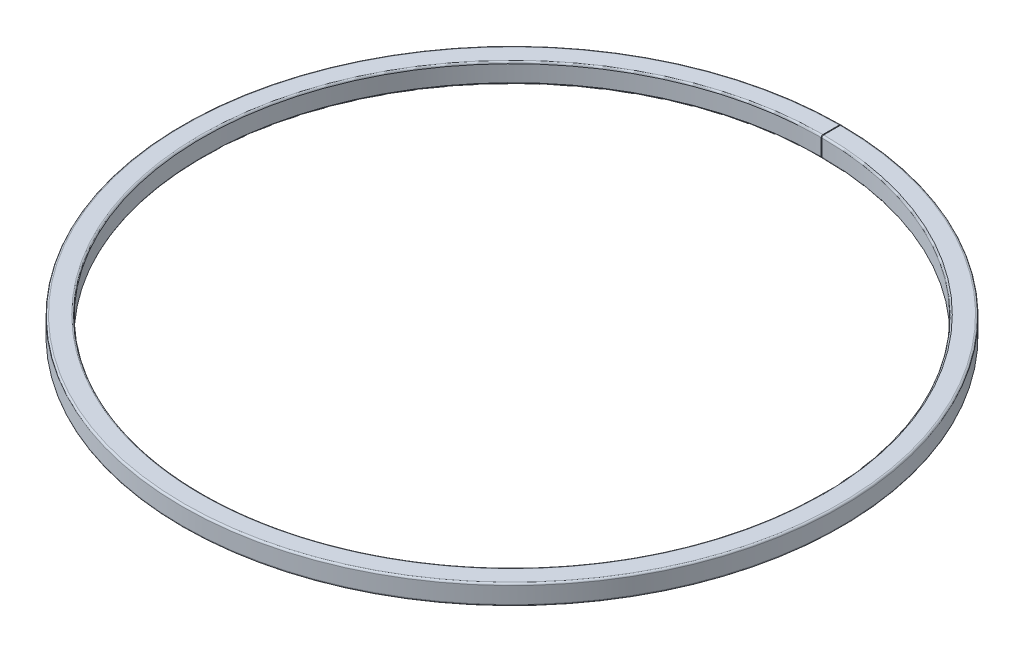
ISO-10303-21;
HEADER;
FILE_DESCRIPTION(('STEP AP214'),'2;1');
FILE_NAME('part.step','',(''),(''),'','','');
FILE_SCHEMA(('AUTOMOTIVE_DESIGN { 1 0 10303 214 1 1 1 1 }'));
ENDSEC;
DATA;
#1=APPLICATION_CONTEXT('core data for automotive mechanical design processes');
#2=APPLICATION_PROTOCOL_DEFINITION('international standard','automotive_design',2000,#1);
#3=PRODUCT_CONTEXT('',#1,'mechanical');
#4=PRODUCT('Part','Part','',(#3));
#5=PRODUCT_RELATED_PRODUCT_CATEGORY('part','',(#4));
#6=PRODUCT_DEFINITION_FORMATION('','',#4);
#7=PRODUCT_DEFINITION_CONTEXT('part definition',#1,'design');
#8=PRODUCT_DEFINITION('design','',#6,#7);
#9=PRODUCT_DEFINITION_SHAPE('','',#8);
#10=(LENGTH_UNIT() NAMED_UNIT(*) SI_UNIT(.MILLI.,.METRE.));
#11=(NAMED_UNIT(*) PLANE_ANGLE_UNIT() SI_UNIT($,.RADIAN.));
#12=(NAMED_UNIT(*) SI_UNIT($,.STERADIAN.) SOLID_ANGLE_UNIT());
#13=UNCERTAINTY_MEASURE_WITH_UNIT(LENGTH_MEASURE(1.E-05),#10,'distance_accuracy_value','');
#14=(GEOMETRIC_REPRESENTATION_CONTEXT(3) GLOBAL_UNCERTAINTY_ASSIGNED_CONTEXT((#13)) GLOBAL_UNIT_ASSIGNED_CONTEXT((#10,
#11,#12)) REPRESENTATION_CONTEXT('',''));
#15=CARTESIAN_POINT('',(0.,0.,0.));
#16=DIRECTION('',(0.,0.,1.));
#17=DIRECTION('',(1.,0.,0.));
#18=AXIS2_PLACEMENT_3D('',#15,#16,#17);
#19=CARTESIAN_POINT('',(0.,10.3,0.));
#20=DIRECTION('',(0.,-1.,0.));
#21=DIRECTION('',(0.,0.,-1.));
#22=AXIS2_PLACEMENT_3D('',#19,#20,#21);
#23=TOROIDAL_SURFACE('',#22,389.7,2.20000000000001);
#24=CARTESIAN_POINT('',(0.,12.5,0.));
#25=DIRECTION('',(0.,-1.,0.));
#26=DIRECTION('',(0.,0.,-1.));
#27=AXIS2_PLACEMENT_3D('',#24,#25,#26);
#28=CIRCLE('',#27,389.7);
#29=CARTESIAN_POINT('',(0.487124999994606,12.5,-389.699695546756));
#30=VERTEX_POINT('',#29);
#31=CARTESIAN_POINT('',(-0.487125000000011,12.5,-389.699695546756));
#32=VERTEX_POINT('',#31);
#33=EDGE_CURVE('E12',#30,#32,#28,.T.);
#34=ORIENTED_EDGE('',*,*,#33,.F.);
#35=CARTESIAN_POINT('',(0.487124999994606,10.3,-389.699695546756));
#36=DIRECTION('',(-0.999999218749695,0.,-0.00124999999998616));
#37=DIRECTION('',(-0.00124999999998616,0.,0.999999218749695));
#38=AXIS2_PLACEMENT_3D('',#35,#36,#37);
#39=CIRCLE('',#38,2.20000000000001);
#40=CARTESIAN_POINT('',(0.484374999994637,10.3,-387.499697265507));
#41=VERTEX_POINT('',#40);
#42=EDGE_CURVE('E261',#41,#30,#39,.T.);
#43=ORIENTED_EDGE('',*,*,#42,.F.);
#44=CARTESIAN_POINT('',(0.,10.3,0.));
#45=DIRECTION('',(0.,-1.,0.));
#46=DIRECTION('',(0.,0.,-1.));
#47=AXIS2_PLACEMENT_3D('',#44,#45,#46);
#48=CIRCLE('',#47,387.5);
#49=CARTESIAN_POINT('',(-0.484375000000011,10.3,-387.499697265507));
#50=VERTEX_POINT('',#49);
#51=EDGE_CURVE('E77',#41,#50,#48,.T.);
#52=ORIENTED_EDGE('',*,*,#51,.T.);
#53=CARTESIAN_POINT('',(-0.487125000000011,10.3,-389.699695546756));
#54=DIRECTION('',(-0.999999218749695,0.,0.00125000000000003));
#55=DIRECTION('',(0.00125000000000003,0.,0.999999218749695));
#56=AXIS2_PLACEMENT_3D('',#53,#54,#55);
#57=CIRCLE('',#56,2.20000000000001);
#58=EDGE_CURVE('E218',#50,#32,#57,.T.);
#59=ORIENTED_EDGE('',*,*,#58,.T.);
#60=EDGE_LOOP('',(#34,#43,#52,#59));
#61=FACE_BOUND('',#60,.T.);
#62=ADVANCED_FACE('F62',(#61),#23,.T.);
#63=CARTESIAN_POINT('',(0.487124999994606,12.5,-389.699695546756));
#64=DIRECTION('',(0.,-1.,0.));
#65=DIRECTION('',(0.,0.,-1.));
#66=AXIS2_PLACEMENT_3D('',#63,#64,#65);
#67=PLANE('',#66);
#68=CARTESIAN_POINT('',(0.,12.5,0.));
#69=DIRECTION('',(0.,-1.,0.));
#70=DIRECTION('',(0.,0.,-1.));
#71=AXIS2_PLACEMENT_3D('',#68,#69,#70);
#72=CIRCLE('',#71,410.3);
#73=CARTESIAN_POINT('',(0.512874999994321,12.5,-410.299679453));
#74=VERTEX_POINT('',#73);
#75=CARTESIAN_POINT('',(-0.512875000000012,12.5,-410.299679453));
#76=VERTEX_POINT('',#75);
#77=EDGE_CURVE('E70',#74,#76,#72,.T.);
#78=ORIENTED_EDGE('',*,*,#77,.F.);
#79=DIRECTION('',(0.00124999999998616,0.,-0.999999218749695));
#80=VECTOR('',#79,1.);
#81=CARTESIAN_POINT('',(0.487124999994606,12.5,-389.699695546756));
#82=LINE('',#81,#80);
#83=EDGE_CURVE('E264',#30,#74,#82,.T.);
#84=ORIENTED_EDGE('',*,*,#83,.F.);
#85=ORIENTED_EDGE('',*,*,#33,.T.);
#86=DIRECTION('',(-0.00125000000000003,0.,-0.999999218749695));
#87=VECTOR('',#86,1.);
#88=CARTESIAN_POINT('',(-0.487125000000011,12.5,-389.699695546756));
#89=LINE('',#88,#87);
#90=EDGE_CURVE('E221',#32,#76,#89,.T.);
#91=ORIENTED_EDGE('',*,*,#90,.T.);
#92=EDGE_LOOP('',(#78,#84,#85,#91));
#93=FACE_BOUND('',#92,.T.);
#94=ADVANCED_FACE('F64',(#93),#67,.F.);
#95=CARTESIAN_POINT('',(0.,10.3,0.));
#96=DIRECTION('',(0.,-1.,0.));
#97=DIRECTION('',(0.,0.,-1.));
#98=AXIS2_PLACEMENT_3D('',#95,#96,#97);
#99=TOROIDAL_SURFACE('',#98,410.3,2.20000000000001);
#100=CARTESIAN_POINT('',(0.,10.3,0.));
#101=DIRECTION('',(0.,-1.,0.));
#102=DIRECTION('',(0.,0.,-1.));
#103=AXIS2_PLACEMENT_3D('',#100,#101,#102);
#104=CIRCLE('',#103,412.5);
#105=CARTESIAN_POINT('',(0.515624999994291,10.3,-412.499677734249));
#106=VERTEX_POINT('',#105);
#107=CARTESIAN_POINT('',(-0.515625000000012,10.3,-412.499677734249));
#108=VERTEX_POINT('',#107);
#109=EDGE_CURVE('E304',#106,#108,#104,.T.);
#110=ORIENTED_EDGE('',*,*,#109,.F.);
#111=CARTESIAN_POINT('',(0.512874999994321,10.3,-410.299679453));
#112=DIRECTION('',(-0.999999218749695,0.,-0.00124999999998616));
#113=DIRECTION('',(-0.00124999999998616,0.,0.999999218749695));
#114=AXIS2_PLACEMENT_3D('',#111,#112,#113);
#115=CIRCLE('',#114,2.20000000000001);
#116=EDGE_CURVE('E267',#74,#106,#115,.T.);
#117=ORIENTED_EDGE('',*,*,#116,.F.);
#118=ORIENTED_EDGE('',*,*,#77,.T.);
#119=CARTESIAN_POINT('',(-0.512875000000012,10.3,-410.299679453));
#120=DIRECTION('',(-0.999999218749695,0.,0.00125000000000003));
#121=DIRECTION('',(0.00125000000000003,0.,0.999999218749695));
#122=AXIS2_PLACEMENT_3D('',#119,#120,#121);
#123=CIRCLE('',#122,2.20000000000001);
#124=EDGE_CURVE('E224',#76,#108,#123,.T.);
#125=ORIENTED_EDGE('',*,*,#124,.T.);
#126=EDGE_LOOP('',(#110,#117,#118,#125));
#127=FACE_BOUND('',#126,.T.);
#128=ADVANCED_FACE('F307',(#127),#99,.T.);
#129=CARTESIAN_POINT('',(0.,0.,0.));
#130=DIRECTION('',(0.,-1.,0.));
#131=DIRECTION('',(0.,0.,-1.));
#132=AXIS2_PLACEMENT_3D('',#129,#130,#131);
#133=CYLINDRICAL_SURFACE('',#132,412.5);
#134=CARTESIAN_POINT('',(0.,-10.3,0.));
#135=DIRECTION('',(0.,-1.,0.));
#136=DIRECTION('',(0.,0.,-1.));
#137=AXIS2_PLACEMENT_3D('',#134,#135,#136);
#138=CIRCLE('',#137,412.5);
#139=CARTESIAN_POINT('',(0.515624999994291,-10.3,-412.499677734249));
#140=VERTEX_POINT('',#139);
#141=CARTESIAN_POINT('',(-0.515625000000012,-10.3,-412.499677734249));
#142=VERTEX_POINT('',#141);
#143=EDGE_CURVE('E302',#140,#142,#138,.T.);
#144=ORIENTED_EDGE('',*,*,#143,.F.);
#145=DIRECTION('',(0.,-1.,0.));
#146=VECTOR('',#145,1.);
#147=CARTESIAN_POINT('',(0.515624999994291,-10.3,-412.499677734249));
#148=LINE('',#147,#146);
#149=EDGE_CURVE('E270',#106,#140,#148,.T.);
#150=ORIENTED_EDGE('',*,*,#149,.F.);
#151=ORIENTED_EDGE('',*,*,#109,.T.);
#152=DIRECTION('',(0.,-1.,0.));
#153=VECTOR('',#152,1.);
#154=CARTESIAN_POINT('',(-0.515625000000012,-10.3,-412.499677734249));
#155=LINE('',#154,#153);
#156=EDGE_CURVE('E227',#108,#142,#155,.T.);
#157=ORIENTED_EDGE('',*,*,#156,.T.);
#158=EDGE_LOOP('',(#144,#150,#151,#157));
#159=FACE_BOUND('',#158,.T.);
#160=ADVANCED_FACE('F317',(#159),#133,.T.);
#161=CARTESIAN_POINT('',(0.,-10.3,0.));
#162=DIRECTION('',(0.,-1.,0.));
#163=DIRECTION('',(0.,0.,-1.));
#164=AXIS2_PLACEMENT_3D('',#161,#162,#163);
#165=TOROIDAL_SURFACE('',#164,410.3,2.20000000000001);
#166=CARTESIAN_POINT('',(0.,-12.5,0.));
#167=DIRECTION('',(0.,-1.,0.));
#168=DIRECTION('',(0.,0.,-1.));
#169=AXIS2_PLACEMENT_3D('',#166,#167,#168);
#170=CIRCLE('',#169,410.3);
#171=CARTESIAN_POINT('',(0.512874999994321,-12.5,-410.299679453));
#172=VERTEX_POINT('',#171);
#173=CARTESIAN_POINT('',(-0.512875000000012,-12.5,-410.299679453));
#174=VERTEX_POINT('',#173);
#175=EDGE_CURVE('E300',#172,#174,#170,.T.);
#176=ORIENTED_EDGE('',*,*,#175,.F.);
#177=CARTESIAN_POINT('',(0.512874999994321,-10.3,-410.299679453));
#178=DIRECTION('',(-0.999999218749695,0.,-0.00124999999998616));
#179=DIRECTION('',(-0.00124999999998616,0.,0.999999218749695));
#180=AXIS2_PLACEMENT_3D('',#177,#178,#179);
#181=CIRCLE('',#180,2.20000000000001);
#182=EDGE_CURVE('E273',#140,#172,#181,.T.);
#183=ORIENTED_EDGE('',*,*,#182,.F.);
#184=ORIENTED_EDGE('',*,*,#143,.T.);
#185=CARTESIAN_POINT('',(-0.512875000000012,-10.3,-410.299679453));
#186=DIRECTION('',(-0.999999218749695,0.,0.00125000000000003));
#187=DIRECTION('',(0.00125000000000003,0.,0.999999218749695));
#188=AXIS2_PLACEMENT_3D('',#185,#186,#187);
#189=CIRCLE('',#188,2.20000000000001);
#190=EDGE_CURVE('E230',#142,#174,#189,.T.);
#191=ORIENTED_EDGE('',*,*,#190,.T.);
#192=EDGE_LOOP('',(#176,#183,#184,#191));
#193=FACE_BOUND('',#192,.T.);
#194=ADVANCED_FACE('F331',(#193),#165,.T.);
#195=CARTESIAN_POINT('',(0.512874999994321,-12.5,-410.299679453));
#196=DIRECTION('',(0.,1.,0.));
#197=DIRECTION('',(0.,0.,1.));
#198=AXIS2_PLACEMENT_3D('',#195,#196,#197);
#199=PLANE('',#198);
#200=CARTESIAN_POINT('',(0.,-12.5,0.));
#201=DIRECTION('',(0.,-1.,0.));
#202=DIRECTION('',(0.,0.,-1.));
#203=AXIS2_PLACEMENT_3D('',#200,#201,#202);
#204=CIRCLE('',#203,389.7);
#205=CARTESIAN_POINT('',(0.487124999994606,-12.5,-389.699695546756));
#206=VERTEX_POINT('',#205);
#207=CARTESIAN_POINT('',(-0.487125000000011,-12.5,-389.699695546756));
#208=VERTEX_POINT('',#207);
#209=EDGE_CURVE('E298',#206,#208,#204,.T.);
#210=ORIENTED_EDGE('',*,*,#209,.F.);
#211=DIRECTION('',(-0.00124999999998616,0.,0.999999218749695));
#212=VECTOR('',#211,1.);
#213=CARTESIAN_POINT('',(0.512874999994321,-12.5,-410.299679453));
#214=LINE('',#213,#212);
#215=EDGE_CURVE('E276',#172,#206,#214,.T.);
#216=ORIENTED_EDGE('',*,*,#215,.F.);
#217=ORIENTED_EDGE('',*,*,#175,.T.);
#218=DIRECTION('',(0.00125000000000003,0.,0.999999218749695));
#219=VECTOR('',#218,1.);
#220=CARTESIAN_POINT('',(-0.512875000000012,-12.5,-410.299679453));
#221=LINE('',#220,#219);
#222=EDGE_CURVE('E233',#174,#208,#221,.T.);
#223=ORIENTED_EDGE('',*,*,#222,.T.);
#224=EDGE_LOOP('',(#210,#216,#217,#223));
#225=FACE_BOUND('',#224,.T.);
#226=ADVANCED_FACE('F328',(#225),#199,.F.);
#227=CARTESIAN_POINT('',(0.,-10.3,0.));
#228=DIRECTION('',(0.,-1.,0.));
#229=DIRECTION('',(0.,0.,-1.));
#230=AXIS2_PLACEMENT_3D('',#227,#228,#229);
#231=TOROIDAL_SURFACE('',#230,389.7,2.20000000000001);
#232=CARTESIAN_POINT('',(0.,-10.3,0.));
#233=DIRECTION('',(0.,-1.,0.));
#234=DIRECTION('',(0.,0.,-1.));
#235=AXIS2_PLACEMENT_3D('',#232,#233,#234);
#236=CIRCLE('',#235,387.5);
#237=CARTESIAN_POINT('',(0.484374999994637,-10.3,-387.499697265507));
#238=VERTEX_POINT('',#237);
#239=CARTESIAN_POINT('',(-0.484375000000011,-10.3,-387.499697265507));
#240=VERTEX_POINT('',#239);
#241=EDGE_CURVE('E85',#238,#240,#236,.T.);
#242=ORIENTED_EDGE('',*,*,#241,.F.);
#243=CARTESIAN_POINT('',(0.487124999994606,-10.3,-389.699695546756));
#244=DIRECTION('',(-0.999999218749695,0.,-0.00124999999998616));
#245=DIRECTION('',(-0.00124999999998616,0.,0.999999218749695));
#246=AXIS2_PLACEMENT_3D('',#243,#244,#245);
#247=CIRCLE('',#246,2.20000000000001);
#248=EDGE_CURVE('E279',#206,#238,#247,.T.);
#249=ORIENTED_EDGE('',*,*,#248,.F.);
#250=ORIENTED_EDGE('',*,*,#209,.T.);
#251=CARTESIAN_POINT('',(-0.487125000000011,-10.3,-389.699695546756));
#252=DIRECTION('',(-0.999999218749695,0.,0.00125000000000003));
#253=DIRECTION('',(0.00125000000000003,0.,0.999999218749695));
#254=AXIS2_PLACEMENT_3D('',#251,#252,#253);
#255=CIRCLE('',#254,2.20000000000001);
#256=EDGE_CURVE('E236',#208,#240,#255,.T.);
#257=ORIENTED_EDGE('',*,*,#256,.T.);
#258=EDGE_LOOP('',(#242,#249,#250,#257));
#259=FACE_BOUND('',#258,.T.);
#260=ADVANCED_FACE('F326',(#259),#231,.T.);
#261=CARTESIAN_POINT('',(0.,10.3,0.));
#262=DIRECTION('',(0.,-1.,0.));
#263=DIRECTION('',(0.,0.,-1.));
#264=AXIS2_PLACEMENT_3D('',#261,#262,#263);
#265=TOROIDAL_SURFACE('',#264,410.3,0.199999999999988);
#266=CARTESIAN_POINT('',(0.,10.5,0.));
#267=DIRECTION('',(0.,-1.,0.));
#268=DIRECTION('',(0.,0.,-1.));
#269=AXIS2_PLACEMENT_3D('',#266,#267,#268);
#270=CIRCLE('',#269,410.3);
#271=CARTESIAN_POINT('',(0.512874999994321,10.5,-410.299679453));
#272=VERTEX_POINT('',#271);
#273=CARTESIAN_POINT('',(-0.512875000000012,10.5,-410.299679453));
#274=VERTEX_POINT('',#273);
#275=EDGE_CURVE('E176',#272,#274,#270,.T.);
#276=ORIENTED_EDGE('',*,*,#275,.F.);
#277=CARTESIAN_POINT('',(0.512874999994321,10.3,-410.299679453));
#278=DIRECTION('',(-0.999999218749695,0.,-0.00124999999998616));
#279=DIRECTION('',(-0.00124999999998616,0.,0.999999218749695));
#280=AXIS2_PLACEMENT_3D('',#277,#278,#279);
#281=CIRCLE('',#280,0.199999999999988);
#282=CARTESIAN_POINT('',(0.513124999994318,10.3,-410.49967929675));
#283=VERTEX_POINT('',#282);
#284=EDGE_CURVE('E240',#272,#283,#281,.T.);
#285=ORIENTED_EDGE('',*,*,#284,.T.);
#286=CARTESIAN_POINT('',(0.,10.3,0.));
#287=DIRECTION('',(0.,-1.,0.));
#288=DIRECTION('',(0.,0.,-1.));
#289=AXIS2_PLACEMENT_3D('',#286,#287,#288);
#290=CIRCLE('',#289,410.5);
#291=CARTESIAN_POINT('',(-0.513125000000012,10.3,-410.49967929675));
#292=VERTEX_POINT('',#291);
#293=EDGE_CURVE('E192',#283,#292,#290,.T.);
#294=ORIENTED_EDGE('',*,*,#293,.T.);
#295=CARTESIAN_POINT('',(-0.512875000000012,10.3,-410.299679453));
#296=DIRECTION('',(-0.999999218749695,0.,0.00125000000000003));
#297=DIRECTION('',(0.00125000000000003,0.,0.999999218749695));
#298=AXIS2_PLACEMENT_3D('',#295,#296,#297);
#299=CIRCLE('',#298,0.199999999999988);
#300=EDGE_CURVE('E190',#274,#292,#299,.T.);
#301=ORIENTED_EDGE('',*,*,#300,.F.);
#302=EDGE_LOOP('',(#276,#285,#294,#301));
#303=FACE_BOUND('',#302,.T.);
#304=ADVANCED_FACE('F191',(#303),#265,.F.);
#305=CARTESIAN_POINT('',(0.487124999994606,10.5,-389.699695546756));
#306=DIRECTION('',(0.,-1.,0.));
#307=DIRECTION('',(0.,0.,-1.));
#308=AXIS2_PLACEMENT_3D('',#305,#306,#307);
#309=PLANE('',#308);
#310=CARTESIAN_POINT('',(0.,10.5,0.));
#311=DIRECTION('',(0.,-1.,0.));
#312=DIRECTION('',(0.,0.,-1.));
#313=AXIS2_PLACEMENT_3D('',#310,#311,#312);
#314=CIRCLE('',#313,389.7);
#315=CARTESIAN_POINT('',(0.487124999994606,10.5,-389.699695546756));
#316=VERTEX_POINT('',#315);
#317=CARTESIAN_POINT('',(-0.487125000000011,10.5,-389.699695546756));
#318=VERTEX_POINT('',#317);
#319=EDGE_CURVE('E187',#316,#318,#314,.T.);
#320=ORIENTED_EDGE('',*,*,#319,.F.);
#321=DIRECTION('',(0.00124999999998616,0.,-0.999999218749695));
#322=VECTOR('',#321,1.);
#323=CARTESIAN_POINT('',(0.487124999994606,10.5,-389.699695546756));
#324=LINE('',#323,#322);
#325=EDGE_CURVE('E183',#316,#272,#324,.T.);
#326=ORIENTED_EDGE('',*,*,#325,.T.);
#327=ORIENTED_EDGE('',*,*,#275,.T.);
#328=DIRECTION('',(-0.00125000000000003,0.,-0.999999218749695));
#329=VECTOR('',#328,1.);
#330=CARTESIAN_POINT('',(-0.487125000000011,10.5,-389.699695546756));
#331=LINE('',#330,#329);
#332=EDGE_CURVE('E180',#318,#274,#331,.T.);
#333=ORIENTED_EDGE('',*,*,#332,.F.);
#334=EDGE_LOOP('',(#320,#326,#327,#333));
#335=FACE_BOUND('',#334,.T.);
#336=ADVANCED_FACE('F178',(#335),#309,.T.);
#337=CARTESIAN_POINT('',(0.,10.3,0.));
#338=DIRECTION('',(0.,-1.,0.));
#339=DIRECTION('',(0.,0.,-1.));
#340=AXIS2_PLACEMENT_3D('',#337,#338,#339);
#341=TOROIDAL_SURFACE('',#340,389.7,0.199999999999988);
#342=CARTESIAN_POINT('',(0.,10.3,0.));
#343=DIRECTION('',(0.,-1.,0.));
#344=DIRECTION('',(0.,0.,-1.));
#345=AXIS2_PLACEMENT_3D('',#342,#343,#344);
#346=CIRCLE('',#345,389.5);
#347=CARTESIAN_POINT('',(0.486874999994609,10.3,-389.499695703006));
#348=VERTEX_POINT('',#347);
#349=CARTESIAN_POINT('',(-0.486875000000011,10.3,-389.499695703006));
#350=VERTEX_POINT('',#349);
#351=EDGE_CURVE('E293',#348,#350,#346,.T.);
#352=ORIENTED_EDGE('',*,*,#351,.F.);
#353=CARTESIAN_POINT('',(0.487124999994606,10.3,-389.699695546756));
#354=DIRECTION('',(-0.999999218749695,0.,-0.00124999999998616));
#355=DIRECTION('',(-0.00124999999998616,0.,0.999999218749695));
#356=AXIS2_PLACEMENT_3D('',#353,#354,#355);
#357=CIRCLE('',#356,0.199999999999988);
#358=EDGE_CURVE('E243',#348,#316,#357,.T.);
#359=ORIENTED_EDGE('',*,*,#358,.T.);
#360=ORIENTED_EDGE('',*,*,#319,.T.);
#361=CARTESIAN_POINT('',(-0.487125000000011,10.3,-389.699695546756));
#362=DIRECTION('',(-0.999999218749695,0.,0.00125000000000003));
#363=DIRECTION('',(0.00125000000000003,0.,0.999999218749695));
#364=AXIS2_PLACEMENT_3D('',#361,#362,#363);
#365=CIRCLE('',#364,0.199999999999988);
#366=EDGE_CURVE('E201',#350,#318,#365,.T.);
#367=ORIENTED_EDGE('',*,*,#366,.F.);
#368=EDGE_LOOP('',(#352,#359,#360,#367));
#369=FACE_BOUND('',#368,.T.);
#370=ADVANCED_FACE('F359',(#369),#341,.F.);
#371=CARTESIAN_POINT('',(0.,0.,0.));
#372=DIRECTION('',(0.,-1.,0.));
#373=DIRECTION('',(0.,0.,-1.));
#374=AXIS2_PLACEMENT_3D('',#371,#372,#373);
#375=CYLINDRICAL_SURFACE('',#374,389.5);
#376=CARTESIAN_POINT('',(0.,-10.3,0.));
#377=DIRECTION('',(0.,-1.,0.));
#378=DIRECTION('',(0.,0.,-1.));
#379=AXIS2_PLACEMENT_3D('',#376,#377,#378);
#380=CIRCLE('',#379,389.5);
#381=CARTESIAN_POINT('',(0.486874999994609,-10.3,-389.499695703006));
#382=VERTEX_POINT('',#381);
#383=CARTESIAN_POINT('',(-0.486875000000011,-10.3,-389.499695703006));
#384=VERTEX_POINT('',#383);
#385=EDGE_CURVE('E291',#382,#384,#380,.T.);
#386=ORIENTED_EDGE('',*,*,#385,.F.);
#387=DIRECTION('',(0.,1.,0.));
#388=VECTOR('',#387,1.);
#389=CARTESIAN_POINT('',(0.486874999994609,10.3,-389.499695703006));
#390=LINE('',#389,#388);
#391=EDGE_CURVE('E246',#382,#348,#390,.T.);
#392=ORIENTED_EDGE('',*,*,#391,.T.);
#393=ORIENTED_EDGE('',*,*,#351,.T.);
#394=DIRECTION('',(0.,1.,0.));
#395=VECTOR('',#394,1.);
#396=CARTESIAN_POINT('',(-0.486875000000011,10.3,-389.499695703006));
#397=LINE('',#396,#395);
#398=EDGE_CURVE('E203',#384,#350,#397,.T.);
#399=ORIENTED_EDGE('',*,*,#398,.F.);
#400=EDGE_LOOP('',(#386,#392,#393,#399));
#401=FACE_BOUND('',#400,.T.);
#402=ADVANCED_FACE('F377',(#401),#375,.T.);
#403=CARTESIAN_POINT('',(0.,-10.3,0.));
#404=DIRECTION('',(0.,-1.,0.));
#405=DIRECTION('',(0.,0.,-1.));
#406=AXIS2_PLACEMENT_3D('',#403,#404,#405);
#407=TOROIDAL_SURFACE('',#406,389.7,0.199999999999986);
#408=CARTESIAN_POINT('',(0.,-10.5,0.));
#409=DIRECTION('',(0.,-1.,0.));
#410=DIRECTION('',(0.,0.,-1.));
#411=AXIS2_PLACEMENT_3D('',#408,#409,#410);
#412=CIRCLE('',#411,389.7);
#413=CARTESIAN_POINT('',(0.487124999994606,-10.5,-389.699695546756));
#414=VERTEX_POINT('',#413);
#415=CARTESIAN_POINT('',(-0.487125000000011,-10.5,-389.699695546756));
#416=VERTEX_POINT('',#415);
#417=EDGE_CURVE('E289',#414,#416,#412,.T.);
#418=ORIENTED_EDGE('',*,*,#417,.F.);
#419=CARTESIAN_POINT('',(0.487124999994606,-10.3,-389.699695546756));
#420=DIRECTION('',(-0.999999218749695,0.,-0.00124999999998616));
#421=DIRECTION('',(-0.00124999999998616,0.,0.999999218749695));
#422=AXIS2_PLACEMENT_3D('',#419,#420,#421);
#423=CIRCLE('',#422,0.199999999999986);
#424=EDGE_CURVE('E249',#414,#382,#423,.T.);
#425=ORIENTED_EDGE('',*,*,#424,.T.);
#426=ORIENTED_EDGE('',*,*,#385,.T.);
#427=CARTESIAN_POINT('',(-0.487125000000011,-10.3,-389.699695546756));
#428=DIRECTION('',(-0.999999218749695,0.,0.00125000000000003));
#429=DIRECTION('',(0.00125000000000003,0.,0.999999218749695));
#430=AXIS2_PLACEMENT_3D('',#427,#428,#429);
#431=CIRCLE('',#430,0.199999999999986);
#432=EDGE_CURVE('E207',#416,#384,#431,.T.);
#433=ORIENTED_EDGE('',*,*,#432,.F.);
#434=EDGE_LOOP('',(#418,#425,#426,#433));
#435=FACE_BOUND('',#434,.T.);
#436=ADVANCED_FACE('F373',(#435),#407,.F.);
#437=CARTESIAN_POINT('',(0.512874999994321,-10.5,-410.299679453));
#438=DIRECTION('',(0.,1.,0.));
#439=DIRECTION('',(0.,0.,1.));
#440=AXIS2_PLACEMENT_3D('',#437,#438,#439);
#441=PLANE('',#440);
#442=CARTESIAN_POINT('',(0.,-10.5,0.));
#443=DIRECTION('',(0.,-1.,0.));
#444=DIRECTION('',(0.,0.,-1.));
#445=AXIS2_PLACEMENT_3D('',#442,#443,#444);
#446=CIRCLE('',#445,410.3);
#447=CARTESIAN_POINT('',(0.512874999994321,-10.5,-410.299679453));
#448=VERTEX_POINT('',#447);
#449=CARTESIAN_POINT('',(-0.512875000000012,-10.5,-410.299679453));
#450=VERTEX_POINT('',#449);
#451=EDGE_CURVE('E287',#448,#450,#446,.T.);
#452=ORIENTED_EDGE('',*,*,#451,.F.);
#453=DIRECTION('',(-0.00124999999998616,0.,0.999999218749695));
#454=VECTOR('',#453,1.);
#455=CARTESIAN_POINT('',(0.512874999994321,-10.5,-410.299679453));
#456=LINE('',#455,#454);
#457=EDGE_CURVE('E252',#448,#414,#456,.T.);
#458=ORIENTED_EDGE('',*,*,#457,.T.);
#459=ORIENTED_EDGE('',*,*,#417,.T.);
#460=DIRECTION('',(0.00125000000000003,0.,0.999999218749695));
#461=VECTOR('',#460,1.);
#462=CARTESIAN_POINT('',(-0.512875000000012,-10.5,-410.299679453));
#463=LINE('',#462,#461);
#464=EDGE_CURVE('E210',#450,#416,#463,.T.);
#465=ORIENTED_EDGE('',*,*,#464,.F.);
#466=EDGE_LOOP('',(#452,#458,#459,#465));
#467=FACE_BOUND('',#466,.T.);
#468=ADVANCED_FACE('F369',(#467),#441,.T.);
#469=CARTESIAN_POINT('',(0.,-10.3,0.));
#470=DIRECTION('',(0.,-1.,0.));
#471=DIRECTION('',(0.,0.,-1.));
#472=AXIS2_PLACEMENT_3D('',#469,#470,#471);
#473=TOROIDAL_SURFACE('',#472,410.3,0.199999999999986);
#474=CARTESIAN_POINT('',(0.,-10.3,0.));
#475=DIRECTION('',(0.,-1.,0.));
#476=DIRECTION('',(0.,0.,-1.));
#477=AXIS2_PLACEMENT_3D('',#474,#475,#476);
#478=CIRCLE('',#477,410.5);
#479=CARTESIAN_POINT('',(0.513124999994318,-10.3,-410.49967929675));
#480=VERTEX_POINT('',#479);
#481=CARTESIAN_POINT('',(-0.513125000000012,-10.3,-410.49967929675));
#482=VERTEX_POINT('',#481);
#483=EDGE_CURVE('E285',#480,#482,#478,.T.);
#484=ORIENTED_EDGE('',*,*,#483,.F.);
#485=CARTESIAN_POINT('',(0.512874999994321,-10.3,-410.299679453));
#486=DIRECTION('',(-0.999999218749695,0.,-0.00124999999998616));
#487=DIRECTION('',(-0.00124999999998616,0.,0.999999218749695));
#488=AXIS2_PLACEMENT_3D('',#485,#486,#487);
#489=CIRCLE('',#488,0.199999999999986);
#490=EDGE_CURVE('E255',#480,#448,#489,.T.);
#491=ORIENTED_EDGE('',*,*,#490,.T.);
#492=ORIENTED_EDGE('',*,*,#451,.T.);
#493=CARTESIAN_POINT('',(-0.512875000000012,-10.3,-410.299679453));
#494=DIRECTION('',(-0.999999218749695,0.,0.00125000000000003));
#495=DIRECTION('',(0.00125000000000003,0.,0.999999218749695));
#496=AXIS2_PLACEMENT_3D('',#493,#494,#495);
#497=CIRCLE('',#496,0.199999999999986);
#498=EDGE_CURVE('E213',#482,#450,#497,.T.);
#499=ORIENTED_EDGE('',*,*,#498,.F.);
#500=EDGE_LOOP('',(#484,#491,#492,#499));
#501=FACE_BOUND('',#500,.T.);
#502=ADVANCED_FACE('F365',(#501),#473,.F.);
#503=CARTESIAN_POINT('',(0.,0.,0.));
#504=DIRECTION('',(0.,-1.,0.));
#505=DIRECTION('',(0.,0.,-1.));
#506=AXIS2_PLACEMENT_3D('',#503,#504,#505);
#507=CYLINDRICAL_SURFACE('',#506,410.5);
#508=DIRECTION('',(0.,-1.,0.));
#509=VECTOR('',#508,1.);
#510=CARTESIAN_POINT('',(0.513124999994318,-10.3,-410.49967929675));
#511=LINE('',#510,#509);
#512=EDGE_CURVE('E258',#283,#480,#511,.T.);
#513=ORIENTED_EDGE('',*,*,#512,.T.);
#514=ORIENTED_EDGE('',*,*,#483,.T.);
#515=DIRECTION('',(0.,-1.,0.));
#516=VECTOR('',#515,1.);
#517=CARTESIAN_POINT('',(-0.513125000000012,-10.3,-410.49967929675));
#518=LINE('',#517,#516);
#519=EDGE_CURVE('E216',#292,#482,#518,.T.);
#520=ORIENTED_EDGE('',*,*,#519,.F.);
#521=ORIENTED_EDGE('',*,*,#293,.F.);
#522=EDGE_LOOP('',(#513,#514,#520,#521));
#523=FACE_BOUND('',#522,.T.);
#524=ADVANCED_FACE('F350',(#523),#507,.F.);
#525=CARTESIAN_POINT('',(0.,0.,0.));
#526=DIRECTION('',(0.,-1.,0.));
#527=DIRECTION('',(0.,0.,-1.));
#528=AXIS2_PLACEMENT_3D('',#525,#526,#527);
#529=CYLINDRICAL_SURFACE('',#528,387.5);
#530=DIRECTION('',(0.,1.,0.));
#531=VECTOR('',#530,1.);
#532=CARTESIAN_POINT('',(0.484374999994637,10.3,-387.499697265507));
#533=LINE('',#532,#531);
#534=EDGE_CURVE('E281',#238,#41,#533,.T.);
#535=ORIENTED_EDGE('',*,*,#534,.F.);
#536=ORIENTED_EDGE('',*,*,#241,.T.);
#537=DIRECTION('',(0.,1.,0.));
#538=VECTOR('',#537,1.);
#539=CARTESIAN_POINT('',(-0.484375000000011,10.3,-387.499697265507));
#540=LINE('',#539,#538);
#541=EDGE_CURVE('E238',#240,#50,#540,.T.);
#542=ORIENTED_EDGE('',*,*,#541,.T.);
#543=ORIENTED_EDGE('',*,*,#51,.F.);
#544=EDGE_LOOP('',(#535,#536,#542,#543));
#545=FACE_BOUND('',#544,.T.);
#546=ADVANCED_FACE('F325',(#545),#529,.F.);
#547=CARTESIAN_POINT('',(0.487124999994606,10.3,-389.699695546756));
#548=DIRECTION('',(-0.999999218749695,0.,-0.00124999999998616));
#549=DIRECTION('',(-0.00124999999998616,0.,0.999999218749695));
#550=AXIS2_PLACEMENT_3D('',#547,#548,#549);
#551=PLANE('',#550);
#552=ORIENTED_EDGE('',*,*,#284,.F.);
#553=ORIENTED_EDGE('',*,*,#325,.F.);
#554=ORIENTED_EDGE('',*,*,#358,.F.);
#555=ORIENTED_EDGE('',*,*,#391,.F.);
#556=ORIENTED_EDGE('',*,*,#424,.F.);
#557=ORIENTED_EDGE('',*,*,#457,.F.);
#558=ORIENTED_EDGE('',*,*,#490,.F.);
#559=ORIENTED_EDGE('',*,*,#512,.F.);
#560=EDGE_LOOP('',(#552,#553,#554,#555,#556,#557,#558,#559));
#561=FACE_BOUND('',#560,.T.);
#562=ORIENTED_EDGE('',*,*,#42,.T.);
#563=ORIENTED_EDGE('',*,*,#83,.T.);
#564=ORIENTED_EDGE('',*,*,#116,.T.);
#565=ORIENTED_EDGE('',*,*,#149,.T.);
#566=ORIENTED_EDGE('',*,*,#182,.T.);
#567=ORIENTED_EDGE('',*,*,#215,.T.);
#568=ORIENTED_EDGE('',*,*,#248,.T.);
#569=ORIENTED_EDGE('',*,*,#534,.T.);
#570=EDGE_LOOP('',(#562,#563,#564,#565,#566,#567,#568,#569));
#571=FACE_BOUND('',#570,.T.);
#572=ADVANCED_FACE('F320',(#561,#571),#551,.T.);
#573=CARTESIAN_POINT('',(-0.487125000000011,10.3,-389.699695546756));
#574=DIRECTION('',(-0.999999218749695,0.,0.00125000000000003));
#575=DIRECTION('',(0.00125000000000003,0.,0.999999218749695));
#576=AXIS2_PLACEMENT_3D('',#573,#574,#575);
#577=PLANE('',#576);
#578=ORIENTED_EDGE('',*,*,#300,.T.);
#579=ORIENTED_EDGE('',*,*,#519,.T.);
#580=ORIENTED_EDGE('',*,*,#498,.T.);
#581=ORIENTED_EDGE('',*,*,#464,.T.);
#582=ORIENTED_EDGE('',*,*,#432,.T.);
#583=ORIENTED_EDGE('',*,*,#398,.T.);
#584=ORIENTED_EDGE('',*,*,#366,.T.);
#585=ORIENTED_EDGE('',*,*,#332,.T.);
#586=EDGE_LOOP('',(#578,#579,#580,#581,#582,#583,#584,#585));
#587=FACE_BOUND('',#586,.T.);
#588=ORIENTED_EDGE('',*,*,#58,.F.);
#589=ORIENTED_EDGE('',*,*,#541,.F.);
#590=ORIENTED_EDGE('',*,*,#256,.F.);
#591=ORIENTED_EDGE('',*,*,#222,.F.);
#592=ORIENTED_EDGE('',*,*,#190,.F.);
#593=ORIENTED_EDGE('',*,*,#156,.F.);
#594=ORIENTED_EDGE('',*,*,#124,.F.);
#595=ORIENTED_EDGE('',*,*,#90,.F.);
#596=EDGE_LOOP('',(#588,#589,#590,#591,#592,#593,#594,#595));
#597=FACE_BOUND('',#596,.T.);
#598=ADVANCED_FACE('F197',(#587,#597),#577,.F.);
#599=CLOSED_SHELL('',(#62,#94,#128,#160,#194,#226,#260,#304,#336,#370,#402,#436,#468,#502,#524,
#546,#572,#598));
#600=MANIFOLD_SOLID_BREP('B2',#599);
#601=ADVANCED_BREP_SHAPE_REPRESENTATION('',(#18,#600),#14);
#602=SHAPE_DEFINITION_REPRESENTATION(#9,#601);
ENDSEC;
END-ISO-10303-21;
